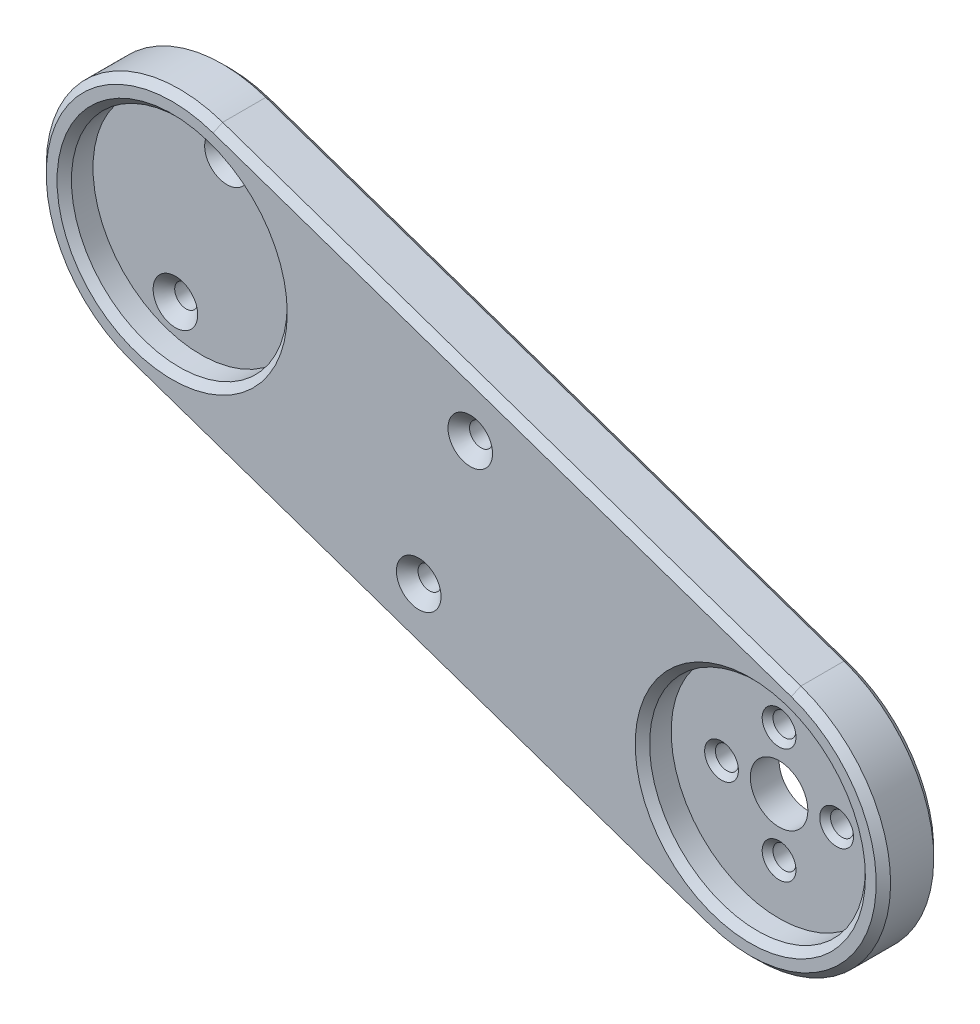
ISO-10303-21;
HEADER;
FILE_DESCRIPTION(('STEP AP214'),'2;1');
FILE_NAME('part.step','',(''),(''),'','','');
FILE_SCHEMA(('AUTOMOTIVE_DESIGN { 1 0 10303 214 1 1 1 1 }'));
ENDSEC;
DATA;
#1=APPLICATION_CONTEXT('core data for automotive mechanical design processes');
#2=APPLICATION_PROTOCOL_DEFINITION('international standard','automotive_design',2000,#1);
#3=PRODUCT_CONTEXT('',#1,'mechanical');
#4=PRODUCT('Part','Part','',(#3));
#5=PRODUCT_RELATED_PRODUCT_CATEGORY('part','',(#4));
#6=PRODUCT_DEFINITION_FORMATION('','',#4);
#7=PRODUCT_DEFINITION_CONTEXT('part definition',#1,'design');
#8=PRODUCT_DEFINITION('design','',#6,#7);
#9=PRODUCT_DEFINITION_SHAPE('','',#8);
#10=(LENGTH_UNIT() NAMED_UNIT(*) SI_UNIT(.MILLI.,.METRE.));
#11=(NAMED_UNIT(*) PLANE_ANGLE_UNIT() SI_UNIT($,.RADIAN.));
#12=(NAMED_UNIT(*) SI_UNIT($,.STERADIAN.) SOLID_ANGLE_UNIT());
#13=UNCERTAINTY_MEASURE_WITH_UNIT(LENGTH_MEASURE(1.E-05),#10,'distance_accuracy_value','');
#14=(GEOMETRIC_REPRESENTATION_CONTEXT(3) GLOBAL_UNCERTAINTY_ASSIGNED_CONTEXT((#13)) GLOBAL_UNIT_ASSIGNED_CONTEXT((#10,
#11,#12)) REPRESENTATION_CONTEXT('',''));
#15=CARTESIAN_POINT('',(0.,0.,0.));
#16=DIRECTION('',(0.,0.,1.));
#17=DIRECTION('',(1.,0.,0.));
#18=AXIS2_PLACEMENT_3D('',#15,#16,#17);
#19=CARTESIAN_POINT('',(0.,0.,8.));
#20=DIRECTION('',(0.,0.,1.));
#21=DIRECTION('',(1.,0.,0.));
#22=AXIS2_PLACEMENT_3D('',#19,#20,#21);
#23=PLANE('',#22);
#24=CARTESIAN_POINT('',(2.24223849890242,2.14230143074263,8.));
#25=DIRECTION('',(0.,0.,1.));
#26=DIRECTION('',(1.,0.,0.));
#27=AXIS2_PLACEMENT_3D('',#24,#25,#26);
#28=CIRCLE('',#27,17.5);
#29=CARTESIAN_POINT('',(-3.45648777626062,-14.4038316172165,8.));
#30=VERTEX_POINT('',#29);
#31=CARTESIAN_POINT('',(7.94096477406545,18.6884344787018,8.));
#32=VERTEX_POINT('',#31);
#33=EDGE_CURVE('E146',#30,#32,#28,.T.);
#34=ORIENTED_EDGE('',*,*,#33,.T.);
#35=DIRECTION('',(-0.945493317026238,0.325641501437888,0.));
#36=VECTOR('',#35,1.);
#37=CARTESIAN_POINT('',(6.5960957782199,19.151626709845,8.));
#38=LINE('',#37,#36);
#39=CARTESIAN_POINT('',(-72.4259671731648,46.3679621009223,8.));
#40=VERTEX_POINT('',#39);
#41=EDGE_CURVE('E150',#32,#40,#38,.T.);
#42=ORIENTED_EDGE('',*,*,#41,.T.);
#43=CARTESIAN_POINT('',(-78.1246934483278,29.8218290529631,8.));
#44=DIRECTION('',(0.,0.,1.));
#45=DIRECTION('',(1.,0.,0.));
#46=AXIS2_PLACEMENT_3D('',#43,#44,#45);
#47=CIRCLE('',#46,17.5);
#48=CARTESIAN_POINT('',(-83.8234197234909,13.2756960050039,8.));
#49=VERTEX_POINT('',#48);
#50=EDGE_CURVE('E148',#40,#49,#47,.T.);
#51=ORIENTED_EDGE('',*,*,#50,.T.);
#52=DIRECTION('',(0.945493317026238,-0.325641501437888,0.));
#53=VECTOR('',#52,1.);
#54=CARTESIAN_POINT('',(-3.45648777626062,-14.4038316172165,8.));
#55=LINE('',#54,#53);
#56=EDGE_CURVE('E143',#49,#30,#55,.T.);
#57=ORIENTED_EDGE('',*,*,#56,.T.);
#58=EDGE_LOOP('',(#34,#42,#51,#57));
#59=FACE_BOUND('',#58,.T.);
#60=CARTESIAN_POINT('',(-36.6830568776465,27.1828714738999,8.));
#61=DIRECTION('',(0.,0.,1.));
#62=DIRECTION('',(1.,0.,0.));
#63=AXIS2_PLACEMENT_3D('',#60,#61,#62);
#64=CIRCLE('',#63,3.10000000000003);
#65=CARTESIAN_POINT('',(-33.5830568776465,27.1828714738999,8.));
#66=VERTEX_POINT('',#65);
#67=EDGE_CURVE('E188',#66,#66,#64,.F.);
#68=ORIENTED_EDGE('',*,*,#67,.T.);
#69=EDGE_LOOP('',(#68));
#70=FACE_BOUND('',#69,.T.);
#71=CARTESIAN_POINT('',(-43.84716990928,6.38201849932264,8.));
#72=DIRECTION('',(0.,0.,1.));
#73=DIRECTION('',(1.,0.,0.));
#74=AXIS2_PLACEMENT_3D('',#71,#72,#73);
#75=CIRCLE('',#74,3.10000000000001);
#76=CARTESIAN_POINT('',(-40.74716990928,6.38201849932264,8.));
#77=VERTEX_POINT('',#76);
#78=EDGE_CURVE('E191',#77,#77,#75,.F.);
#79=ORIENTED_EDGE('',*,*,#78,.T.);
#80=EDGE_LOOP('',(#79));
#81=FACE_BOUND('',#80,.T.);
#82=CARTESIAN_POINT('',(-78.1246934483278,29.8218290529631,8.));
#83=DIRECTION('',(0.,0.,1.));
#84=DIRECTION('',(1.,0.,0.));
#85=AXIS2_PLACEMENT_3D('',#82,#83,#84);
#86=CIRCLE('',#85,16.);
#87=CARTESIAN_POINT('',(-62.1246934483278,29.8218290529631,8.));
#88=VERTEX_POINT('',#87);
#89=EDGE_CURVE('E223',#88,#88,#86,.F.);
#90=ORIENTED_EDGE('',*,*,#89,.T.);
#91=EDGE_LOOP('',(#90));
#92=FACE_BOUND('',#91,.T.);
#93=CARTESIAN_POINT('',(2.24223849890242,2.14230143074263,8.));
#94=DIRECTION('',(0.,0.,1.));
#95=DIRECTION('',(1.,0.,0.));
#96=AXIS2_PLACEMENT_3D('',#93,#94,#95);
#97=CIRCLE('',#96,16.);
#98=CARTESIAN_POINT('',(18.2422384989025,2.14230143074263,8.));
#99=VERTEX_POINT('',#98);
#100=EDGE_CURVE('E220',#99,#99,#97,.F.);
#101=ORIENTED_EDGE('',*,*,#100,.T.);
#102=EDGE_LOOP('',(#101));
#103=FACE_BOUND('',#102,.T.);
#104=ADVANCED_FACE('F38',(#59,#70,#81,#92,#103),#23,.T.);
#105=CARTESIAN_POINT('',(0.,0.,0.));
#106=DIRECTION('',(0.,0.,1.));
#107=DIRECTION('',(1.,0.,0.));
#108=AXIS2_PLACEMENT_3D('',#105,#106,#107);
#109=PLANE('',#108);
#110=CARTESIAN_POINT('',(-78.1246934483278,29.8218290529631,0.));
#111=DIRECTION('',(0.,0.,1.));
#112=DIRECTION('',(1.,0.,0.));
#113=AXIS2_PLACEMENT_3D('',#110,#111,#112);
#114=CIRCLE('',#113,17.5);
#115=CARTESIAN_POINT('',(-83.8234197234909,13.2756960050039,0.));
#116=VERTEX_POINT('',#115);
#117=CARTESIAN_POINT('',(-72.4259671731648,46.3679621009223,0.));
#118=VERTEX_POINT('',#117);
#119=EDGE_CURVE('E115',#116,#118,#114,.F.);
#120=ORIENTED_EDGE('',*,*,#119,.T.);
#121=DIRECTION('',(0.945493317026238,-0.325641501437888,0.));
#122=VECTOR('',#121,1.);
#123=CARTESIAN_POINT('',(7.94096477406545,18.6884344787018,0.));
#124=LINE('',#123,#122);
#125=CARTESIAN_POINT('',(7.94096477406545,18.6884344787018,0.));
#126=VERTEX_POINT('',#125);
#127=EDGE_CURVE('E111',#118,#126,#124,.T.);
#128=ORIENTED_EDGE('',*,*,#127,.T.);
#129=CARTESIAN_POINT('',(2.24223849890242,2.14230143074263,0.));
#130=DIRECTION('',(0.,0.,1.));
#131=DIRECTION('',(1.,0.,0.));
#132=AXIS2_PLACEMENT_3D('',#129,#130,#131);
#133=CIRCLE('',#132,17.5);
#134=CARTESIAN_POINT('',(-3.45648777626062,-14.4038316172165,0.));
#135=VERTEX_POINT('',#134);
#136=EDGE_CURVE('E104',#126,#135,#133,.F.);
#137=ORIENTED_EDGE('',*,*,#136,.T.);
#138=DIRECTION('',(-0.945493317026238,0.325641501437888,0.));
#139=VECTOR('',#138,1.);
#140=CARTESIAN_POINT('',(-4.80135677210617,-13.9406393860733,0.));
#141=LINE('',#140,#139);
#142=EDGE_CURVE('E108',#135,#116,#141,.T.);
#143=ORIENTED_EDGE('',*,*,#142,.T.);
#144=EDGE_LOOP('',(#120,#128,#137,#143));
#145=FACE_BOUND('',#144,.T.);
#146=CARTESIAN_POINT('',(-74.502789558696,40.2085315314155,0.));
#147=DIRECTION('',(0.,0.,1.));
#148=DIRECTION('',(1.,0.,0.));
#149=AXIS2_PLACEMENT_3D('',#146,#147,#148);
#150=CIRCLE('',#149,1.6);
#151=CARTESIAN_POINT('',(-72.902789558696,40.2085315314155,0.));
#152=VERTEX_POINT('',#151);
#153=EDGE_CURVE('E214',#152,#152,#150,.T.);
#154=ORIENTED_EDGE('',*,*,#153,.T.);
#155=EDGE_LOOP('',(#154));
#156=FACE_BOUND('',#155,.T.);
#157=CARTESIAN_POINT('',(-43.84716990928,6.38201849932264,0.));
#158=DIRECTION('',(0.,0.,1.));
#159=DIRECTION('',(1.,0.,0.));
#160=AXIS2_PLACEMENT_3D('',#157,#158,#159);
#161=CIRCLE('',#160,1.6);
#162=CARTESIAN_POINT('',(-42.24716990928,6.38201849932264,0.));
#163=VERTEX_POINT('',#162);
#164=EDGE_CURVE('E211',#163,#163,#161,.T.);
#165=ORIENTED_EDGE('',*,*,#164,.T.);
#166=EDGE_LOOP('',(#165));
#167=FACE_BOUND('',#166,.T.);
#168=CARTESIAN_POINT('',(2.24223849890242,2.14230143074263,0.));
#169=DIRECTION('',(0.,0.,1.));
#170=DIRECTION('',(1.,0.,0.));
#171=AXIS2_PLACEMENT_3D('',#168,#169,#170);
#172=CIRCLE('',#171,4.00000000000001);
#173=CARTESIAN_POINT('',(6.24223849890242,2.14230143074263,0.));
#174=VERTEX_POINT('',#173);
#175=EDGE_CURVE('E217',#174,#174,#172,.T.);
#176=ORIENTED_EDGE('',*,*,#175,.T.);
#177=EDGE_LOOP('',(#176));
#178=FACE_BOUND('',#177,.T.);
#179=CARTESIAN_POINT('',(2.24223849890242,10.1423014307426,0.));
#180=DIRECTION('',(0.,0.,1.));
#181=DIRECTION('',(1.,0.,0.));
#182=AXIS2_PLACEMENT_3D('',#179,#180,#181);
#183=CIRCLE('',#182,1.6);
#184=CARTESIAN_POINT('',(3.84223849890242,10.1423014307426,0.));
#185=VERTEX_POINT('',#184);
#186=EDGE_CURVE('E276',#185,#185,#183,.T.);
#187=ORIENTED_EDGE('',*,*,#186,.T.);
#188=EDGE_LOOP('',(#187));
#189=FACE_BOUND('',#188,.T.);
#190=CARTESIAN_POINT('',(-5.75776150109758,2.14230143074263,0.));
#191=DIRECTION('',(0.,0.,1.));
#192=DIRECTION('',(1.,0.,0.));
#193=AXIS2_PLACEMENT_3D('',#190,#191,#192);
#194=CIRCLE('',#193,1.6);
#195=CARTESIAN_POINT('',(-4.15776150109758,2.14230143074263,0.));
#196=VERTEX_POINT('',#195);
#197=EDGE_CURVE('E273',#196,#196,#194,.T.);
#198=ORIENTED_EDGE('',*,*,#197,.T.);
#199=EDGE_LOOP('',(#198));
#200=FACE_BOUND('',#199,.T.);
#201=CARTESIAN_POINT('',(10.2422384989024,2.14230143074263,0.));
#202=DIRECTION('',(0.,0.,1.));
#203=DIRECTION('',(1.,0.,0.));
#204=AXIS2_PLACEMENT_3D('',#201,#202,#203);
#205=CIRCLE('',#204,1.60000000000001);
#206=CARTESIAN_POINT('',(11.8422384989024,2.14230143074263,0.));
#207=VERTEX_POINT('',#206);
#208=EDGE_CURVE('E270',#207,#207,#205,.T.);
#209=ORIENTED_EDGE('',*,*,#208,.T.);
#210=EDGE_LOOP('',(#209));
#211=FACE_BOUND('',#210,.T.);
#212=CARTESIAN_POINT('',(2.24223849890242,-5.85769856925737,0.));
#213=DIRECTION('',(0.,0.,1.));
#214=DIRECTION('',(1.,0.,0.));
#215=AXIS2_PLACEMENT_3D('',#212,#213,#214);
#216=CIRCLE('',#215,1.60000000000001);
#217=CARTESIAN_POINT('',(3.84223849890242,-5.85769856925737,0.));
#218=VERTEX_POINT('',#217);
#219=EDGE_CURVE('E267',#218,#218,#216,.T.);
#220=ORIENTED_EDGE('',*,*,#219,.T.);
#221=EDGE_LOOP('',(#220));
#222=FACE_BOUND('',#221,.T.);
#223=CARTESIAN_POINT('',(-81.6669025903295,19.4076785568382,0.));
#224=DIRECTION('',(0.,0.,1.));
#225=DIRECTION('',(1.,0.,0.));
#226=AXIS2_PLACEMENT_3D('',#223,#224,#225);
#227=CIRCLE('',#226,1.6);
#228=CARTESIAN_POINT('',(-80.0669025903295,19.4076785568382,0.));
#229=VERTEX_POINT('',#228);
#230=EDGE_CURVE('E133',#229,#229,#227,.F.);
#231=ORIENTED_EDGE('',*,*,#230,.F.);
#232=EDGE_LOOP('',(#231));
#233=FACE_BOUND('',#232,.T.);
#234=CARTESIAN_POINT('',(-36.6830568776465,27.1828714738999,0.));
#235=DIRECTION('',(0.,0.,1.));
#236=DIRECTION('',(1.,0.,0.));
#237=AXIS2_PLACEMENT_3D('',#234,#235,#236);
#238=CIRCLE('',#237,1.6);
#239=CARTESIAN_POINT('',(-35.0830568776465,27.1828714738999,0.));
#240=VERTEX_POINT('',#239);
#241=EDGE_CURVE('E207',#240,#240,#238,.F.);
#242=ORIENTED_EDGE('',*,*,#241,.F.);
#243=EDGE_LOOP('',(#242));
#244=FACE_BOUND('',#243,.T.);
#245=ADVANCED_FACE('F106',(#145,#156,#167,#178,#189,#200,#211,#222,#233,#244),#109,.F.);
#246=CARTESIAN_POINT('',(0.,0.,4.));
#247=DIRECTION('',(0.,0.,1.));
#248=DIRECTION('',(1.,0.,0.));
#249=AXIS2_PLACEMENT_3D('',#246,#247,#248);
#250=PLANE('',#249);
#251=CARTESIAN_POINT('',(-74.502789558696,40.2085315314155,4.));
#252=DIRECTION('',(0.,0.,1.));
#253=DIRECTION('',(1.,0.,0.));
#254=AXIS2_PLACEMENT_3D('',#251,#252,#253);
#255=CIRCLE('',#254,3.10000000000003);
#256=CARTESIAN_POINT('',(-71.4027895586959,40.2085315314155,4.));
#257=VERTEX_POINT('',#256);
#258=EDGE_CURVE('E197',#257,#257,#255,.F.);
#259=ORIENTED_EDGE('',*,*,#258,.T.);
#260=EDGE_LOOP('',(#259));
#261=FACE_BOUND('',#260,.T.);
#262=CARTESIAN_POINT('',(-81.6669025903295,19.4076785568382,4.));
#263=DIRECTION('',(0.,0.,1.));
#264=DIRECTION('',(1.,0.,0.));
#265=AXIS2_PLACEMENT_3D('',#262,#263,#264);
#266=CIRCLE('',#265,3.10000000000003);
#267=CARTESIAN_POINT('',(-78.5669025903295,19.4076785568382,4.));
#268=VERTEX_POINT('',#267);
#269=EDGE_CURVE('E200',#268,#268,#266,.F.);
#270=ORIENTED_EDGE('',*,*,#269,.T.);
#271=EDGE_LOOP('',(#270));
#272=FACE_BOUND('',#271,.T.);
#273=CARTESIAN_POINT('',(-78.1246934483278,29.8218290529631,4.));
#274=DIRECTION('',(0.,0.,1.));
#275=DIRECTION('',(1.,0.,0.));
#276=AXIS2_PLACEMENT_3D('',#273,#274,#275);
#277=CIRCLE('',#276,15.);
#278=CARTESIAN_POINT('',(-63.1246934483278,29.8218290529631,4.));
#279=VERTEX_POINT('',#278);
#280=EDGE_CURVE('E253',#279,#279,#277,.T.);
#281=ORIENTED_EDGE('',*,*,#280,.T.);
#282=EDGE_LOOP('',(#281));
#283=FACE_BOUND('',#282,.T.);
#284=ADVANCED_FACE('F290',(#261,#272,#283),#250,.T.);
#285=CARTESIAN_POINT('',(-5.12699827354406,-14.8861327030995,8.));
#286=DIRECTION('',(0.325641501437888,0.945493317026238,0.));
#287=DIRECTION('',(-0.945493317026238,0.325641501437888,0.));
#288=AXIS2_PLACEMENT_3D('',#285,#286,#287);
#289=PLANE('',#288);
#290=DIRECTION('',(0.,0.,-1.));
#291=VECTOR('',#290,1.);
#292=CARTESIAN_POINT('',(-3.7821292776985,-15.3493249342428,8.));
#293=LINE('',#292,#291);
#294=CARTESIAN_POINT('',(-3.7821292776985,-15.3493249342428,7.00000000000002));
#295=VERTEX_POINT('',#294);
#296=CARTESIAN_POINT('',(-3.7821292776985,-15.3493249342428,0.999999999999987));
#297=VERTEX_POINT('',#296);
#298=EDGE_CURVE('E259',#295,#297,#293,.T.);
#299=ORIENTED_EDGE('',*,*,#298,.F.);
#300=DIRECTION('',(-0.945493317026238,0.325641501437888,0.));
#301=VECTOR('',#300,1.);
#302=CARTESIAN_POINT('',(-84.1490612249288,12.3302026879777,7.00000000000002));
#303=LINE('',#302,#301);
#304=CARTESIAN_POINT('',(-84.1490612249288,12.3302026879777,7.00000000000002));
#305=VERTEX_POINT('',#304);
#306=EDGE_CURVE('E11',#295,#305,#303,.T.);
#307=ORIENTED_EDGE('',*,*,#306,.T.);
#308=DIRECTION('',(0.,0.,-1.));
#309=VECTOR('',#308,1.);
#310=CARTESIAN_POINT('',(-84.1490612249288,12.3302026879777,8.));
#311=LINE('',#310,#309);
#312=CARTESIAN_POINT('',(-84.1490612249288,12.3302026879777,0.999999999999987));
#313=VERTEX_POINT('',#312);
#314=EDGE_CURVE('E265',#305,#313,#311,.T.);
#315=ORIENTED_EDGE('',*,*,#314,.T.);
#316=DIRECTION('',(0.945493317026238,-0.325641501437888,0.));
#317=VECTOR('',#316,1.);
#318=CARTESIAN_POINT('',(-5.12699827354406,-14.8861327030995,0.999999999999987));
#319=LINE('',#318,#317);
#320=EDGE_CURVE('E144',#313,#297,#319,.T.);
#321=ORIENTED_EDGE('',*,*,#320,.T.);
#322=EDGE_LOOP('',(#299,#307,#315,#321));
#323=FACE_BOUND('',#322,.T.);
#324=ADVANCED_FACE('F335',(#323),#289,.F.);
#325=CARTESIAN_POINT('',(2.24223849890242,2.14230143074263,8.));
#326=DIRECTION('',(0.,0.,-1.));
#327=DIRECTION('',(-1.,0.,0.));
#328=AXIS2_PLACEMENT_3D('',#325,#326,#327);
#329=CYLINDRICAL_SURFACE('',#328,18.5);
#330=DIRECTION('',(0.,0.,-1.));
#331=VECTOR('',#330,1.);
#332=CARTESIAN_POINT('',(8.26660627550334,19.633927795728,8.));
#333=LINE('',#332,#331);
#334=CARTESIAN_POINT('',(8.26660627550334,19.633927795728,7.00000000000001));
#335=VERTEX_POINT('',#334);
#336=CARTESIAN_POINT('',(8.26660627550334,19.633927795728,0.999999999999987));
#337=VERTEX_POINT('',#336);
#338=EDGE_CURVE('E261',#335,#337,#333,.T.);
#339=ORIENTED_EDGE('',*,*,#338,.F.);
#340=CARTESIAN_POINT('',(2.24223849890242,2.14230143074263,7.00000000000001));
#341=DIRECTION('',(0.,0.,1.));
#342=DIRECTION('',(1.,0.,0.));
#343=AXIS2_PLACEMENT_3D('',#340,#341,#342);
#344=CIRCLE('',#343,18.5);
#345=EDGE_CURVE('E48',#335,#295,#344,.F.);
#346=ORIENTED_EDGE('',*,*,#345,.T.);
#347=ORIENTED_EDGE('',*,*,#298,.T.);
#348=CARTESIAN_POINT('',(2.24223849890242,2.14230143074263,0.999999999999987));
#349=DIRECTION('',(0.,0.,1.));
#350=DIRECTION('',(1.,0.,0.));
#351=AXIS2_PLACEMENT_3D('',#348,#349,#350);
#352=CIRCLE('',#351,18.5);
#353=EDGE_CURVE('E130',#297,#337,#352,.T.);
#354=ORIENTED_EDGE('',*,*,#353,.T.);
#355=EDGE_LOOP('',(#339,#346,#347,#354));
#356=FACE_BOUND('',#355,.T.);
#357=ADVANCED_FACE('F331',(#356),#329,.T.);
#358=CARTESIAN_POINT('',(6.92173727965778,20.0971200268713,8.));
#359=DIRECTION('',(0.325641501437888,0.945493317026238,0.));
#360=DIRECTION('',(-0.945493317026238,0.325641501437888,0.));
#361=AXIS2_PLACEMENT_3D('',#358,#359,#360);
#362=PLANE('',#361);
#363=DIRECTION('',(0.,0.,-1.));
#364=VECTOR('',#363,1.);
#365=CARTESIAN_POINT('',(-72.1003256717269,47.3134554179485,8.));
#366=LINE('',#365,#364);
#367=CARTESIAN_POINT('',(-72.1003256717269,47.3134554179485,7.00000000000001));
#368=VERTEX_POINT('',#367);
#369=CARTESIAN_POINT('',(-72.1003256717269,47.3134554179485,0.999999999999987));
#370=VERTEX_POINT('',#369);
#371=EDGE_CURVE('E263',#368,#370,#366,.T.);
#372=ORIENTED_EDGE('',*,*,#371,.F.);
#373=DIRECTION('',(0.945493317026238,-0.325641501437888,0.));
#374=VECTOR('',#373,1.);
#375=CARTESIAN_POINT('',(6.92173727965778,20.0971200268713,7.00000000000001));
#376=LINE('',#375,#374);
#377=EDGE_CURVE('E140',#368,#335,#376,.T.);
#378=ORIENTED_EDGE('',*,*,#377,.T.);
#379=ORIENTED_EDGE('',*,*,#338,.T.);
#380=DIRECTION('',(-0.945493317026238,0.325641501437888,0.));
#381=VECTOR('',#380,1.);
#382=CARTESIAN_POINT('',(-72.1003256717269,47.3134554179485,0.999999999999987));
#383=LINE('',#382,#381);
#384=EDGE_CURVE('E178',#337,#370,#383,.T.);
#385=ORIENTED_EDGE('',*,*,#384,.T.);
#386=EDGE_LOOP('',(#372,#378,#379,#385));
#387=FACE_BOUND('',#386,.T.);
#388=ADVANCED_FACE('F327',(#387),#362,.T.);
#389=CARTESIAN_POINT('',(2.24223849890242,2.14230143074263,8.));
#390=DIRECTION('',(0.,0.,-1.));
#391=DIRECTION('',(-1.,0.,0.));
#392=AXIS2_PLACEMENT_3D('',#389,#390,#391);
#393=CYLINDRICAL_SURFACE('',#392,15.);
#394=CARTESIAN_POINT('',(2.24223849890242,2.14230143074263,6.99999999999997));
#395=DIRECTION('',(0.,0.,1.));
#396=DIRECTION('',(1.,0.,0.));
#397=AXIS2_PLACEMENT_3D('',#394,#395,#396);
#398=CIRCLE('',#397,15.);
#399=CARTESIAN_POINT('',(17.2422384989024,2.14230143074263,6.99999999999997));
#400=VERTEX_POINT('',#399);
#401=EDGE_CURVE('E226',#400,#400,#398,.T.);
#402=ORIENTED_EDGE('',*,*,#401,.T.);
#403=EDGE_LOOP('',(#402));
#404=FACE_BOUND('',#403,.T.);
#405=CARTESIAN_POINT('',(2.24223849890242,2.14230143074263,4.));
#406=DIRECTION('',(0.,0.,1.));
#407=DIRECTION('',(1.,0.,0.));
#408=AXIS2_PLACEMENT_3D('',#405,#406,#407);
#409=CIRCLE('',#408,15.);
#410=CARTESIAN_POINT('',(17.2422384989024,2.14230143074263,4.));
#411=VERTEX_POINT('',#410);
#412=EDGE_CURVE('E256',#411,#411,#409,.T.);
#413=ORIENTED_EDGE('',*,*,#412,.F.);
#414=EDGE_LOOP('',(#413));
#415=FACE_BOUND('',#414,.T.);
#416=ADVANCED_FACE('F330',(#404,#415),#393,.F.);
#417=CARTESIAN_POINT('',(-78.1246934483278,29.8218290529631,8.));
#418=DIRECTION('',(0.,0.,-1.));
#419=DIRECTION('',(-1.,0.,0.));
#420=AXIS2_PLACEMENT_3D('',#417,#418,#419);
#421=CYLINDRICAL_SURFACE('',#420,15.);
#422=CARTESIAN_POINT('',(-78.1246934483278,29.8218290529631,6.99999999999997));
#423=DIRECTION('',(0.,0.,1.));
#424=DIRECTION('',(1.,0.,0.));
#425=AXIS2_PLACEMENT_3D('',#422,#423,#424);
#426=CIRCLE('',#425,15.);
#427=CARTESIAN_POINT('',(-63.1246934483278,29.8218290529631,6.99999999999997));
#428=VERTEX_POINT('',#427);
#429=EDGE_CURVE('E206',#428,#428,#426,.T.);
#430=ORIENTED_EDGE('',*,*,#429,.T.);
#431=EDGE_LOOP('',(#430));
#432=FACE_BOUND('',#431,.T.);
#433=ORIENTED_EDGE('',*,*,#280,.F.);
#434=EDGE_LOOP('',(#433));
#435=FACE_BOUND('',#434,.T.);
#436=ADVANCED_FACE('F325',(#432,#435),#421,.F.);
#437=CARTESIAN_POINT('',(-78.1246934483278,29.8218290529631,8.));
#438=DIRECTION('',(0.,0.,-1.));
#439=DIRECTION('',(-1.,0.,0.));
#440=AXIS2_PLACEMENT_3D('',#437,#438,#439);
#441=CYLINDRICAL_SURFACE('',#440,18.5);
#442=ORIENTED_EDGE('',*,*,#314,.F.);
#443=CARTESIAN_POINT('',(-78.1246934483278,29.8218290529631,7.00000000000001));
#444=DIRECTION('',(0.,0.,1.));
#445=DIRECTION('',(1.,0.,0.));
#446=AXIS2_PLACEMENT_3D('',#443,#444,#445);
#447=CIRCLE('',#446,18.5);
#448=EDGE_CURVE('E153',#305,#368,#447,.F.);
#449=ORIENTED_EDGE('',*,*,#448,.T.);
#450=ORIENTED_EDGE('',*,*,#371,.T.);
#451=CARTESIAN_POINT('',(-78.1246934483278,29.8218290529631,0.999999999999987));
#452=DIRECTION('',(0.,0.,1.));
#453=DIRECTION('',(1.,0.,0.));
#454=AXIS2_PLACEMENT_3D('',#451,#452,#453);
#455=CIRCLE('',#454,18.5);
#456=EDGE_CURVE('E175',#370,#313,#455,.T.);
#457=ORIENTED_EDGE('',*,*,#456,.T.);
#458=EDGE_LOOP('',(#442,#449,#450,#457));
#459=FACE_BOUND('',#458,.T.);
#460=ADVANCED_FACE('F321',(#459),#441,.T.);
#461=CARTESIAN_POINT('',(2.24223849890242,-5.85769856925737,4.));
#462=DIRECTION('',(0.,0.,-1.));
#463=DIRECTION('',(-1.,0.,0.));
#464=AXIS2_PLACEMENT_3D('',#461,#462,#463);
#465=CYLINDRICAL_SURFACE('',#464,1.60000000000001);
#466=CARTESIAN_POINT('',(2.24223849890242,-5.85769856925737,3.25000000000001));
#467=DIRECTION('',(0.,0.,1.));
#468=DIRECTION('',(1.,0.,0.));
#469=AXIS2_PLACEMENT_3D('',#466,#467,#468);
#470=CIRCLE('',#469,1.60000000000001);
#471=CARTESIAN_POINT('',(3.84223849890242,-5.85769856925737,3.25000000000001));
#472=VERTEX_POINT('',#471);
#473=EDGE_CURVE('E235',#472,#472,#470,.T.);
#474=ORIENTED_EDGE('',*,*,#473,.T.);
#475=EDGE_LOOP('',(#474));
#476=FACE_BOUND('',#475,.T.);
#477=ORIENTED_EDGE('',*,*,#219,.F.);
#478=EDGE_LOOP('',(#477));
#479=FACE_BOUND('',#478,.T.);
#480=ADVANCED_FACE('F324',(#476,#479),#465,.F.);
#481=CARTESIAN_POINT('',(10.2422384989024,2.14230143074263,4.));
#482=DIRECTION('',(0.,0.,-1.));
#483=DIRECTION('',(-1.,0.,0.));
#484=AXIS2_PLACEMENT_3D('',#481,#482,#483);
#485=CYLINDRICAL_SURFACE('',#484,1.60000000000001);
#486=CARTESIAN_POINT('',(10.2422384989024,2.14230143074263,3.24999999999998));
#487=DIRECTION('',(0.,0.,1.));
#488=DIRECTION('',(1.,0.,0.));
#489=AXIS2_PLACEMENT_3D('',#486,#487,#488);
#490=CIRCLE('',#489,1.60000000000001);
#491=CARTESIAN_POINT('',(11.8422384989024,2.14230143074263,3.24999999999998));
#492=VERTEX_POINT('',#491);
#493=EDGE_CURVE('E232',#492,#492,#490,.T.);
#494=ORIENTED_EDGE('',*,*,#493,.T.);
#495=EDGE_LOOP('',(#494));
#496=FACE_BOUND('',#495,.T.);
#497=ORIENTED_EDGE('',*,*,#208,.F.);
#498=EDGE_LOOP('',(#497));
#499=FACE_BOUND('',#498,.T.);
#500=ADVANCED_FACE('F624',(#496,#499),#485,.F.);
#501=CARTESIAN_POINT('',(-5.75776150109758,2.14230143074263,4.));
#502=DIRECTION('',(0.,0.,-1.));
#503=DIRECTION('',(-1.,0.,0.));
#504=AXIS2_PLACEMENT_3D('',#501,#502,#503);
#505=CYLINDRICAL_SURFACE('',#504,1.6);
#506=CARTESIAN_POINT('',(-5.75776150109758,2.14230143074263,3.25));
#507=DIRECTION('',(0.,0.,1.));
#508=DIRECTION('',(1.,0.,0.));
#509=AXIS2_PLACEMENT_3D('',#506,#507,#508);
#510=CIRCLE('',#509,1.6);
#511=CARTESIAN_POINT('',(-4.15776150109758,2.14230143074263,3.25));
#512=VERTEX_POINT('',#511);
#513=EDGE_CURVE('E250',#512,#512,#510,.T.);
#514=ORIENTED_EDGE('',*,*,#513,.T.);
#515=EDGE_LOOP('',(#514));
#516=FACE_BOUND('',#515,.T.);
#517=ORIENTED_EDGE('',*,*,#197,.F.);
#518=EDGE_LOOP('',(#517));
#519=FACE_BOUND('',#518,.T.);
#520=ADVANCED_FACE('F615',(#516,#519),#505,.F.);
#521=CARTESIAN_POINT('',(2.24223849890242,10.1423014307426,4.));
#522=DIRECTION('',(0.,0.,-1.));
#523=DIRECTION('',(-1.,0.,0.));
#524=AXIS2_PLACEMENT_3D('',#521,#522,#523);
#525=CYLINDRICAL_SURFACE('',#524,1.6);
#526=CARTESIAN_POINT('',(2.24223849890242,10.1423014307426,3.25));
#527=DIRECTION('',(0.,0.,1.));
#528=DIRECTION('',(1.,0.,0.));
#529=AXIS2_PLACEMENT_3D('',#526,#527,#528);
#530=CIRCLE('',#529,1.6);
#531=CARTESIAN_POINT('',(3.84223849890242,10.1423014307426,3.25));
#532=VERTEX_POINT('',#531);
#533=EDGE_CURVE('E229',#532,#532,#530,.T.);
#534=ORIENTED_EDGE('',*,*,#533,.T.);
#535=EDGE_LOOP('',(#534));
#536=FACE_BOUND('',#535,.T.);
#537=ORIENTED_EDGE('',*,*,#186,.F.);
#538=EDGE_LOOP('',(#537));
#539=FACE_BOUND('',#538,.T.);
#540=ADVANCED_FACE('F318',(#536,#539),#525,.F.);
#541=CARTESIAN_POINT('',(0.,0.,4.));
#542=DIRECTION('',(0.,0.,1.));
#543=DIRECTION('',(1.,0.,0.));
#544=AXIS2_PLACEMENT_3D('',#541,#542,#543);
#545=PLANE('',#544);
#546=CARTESIAN_POINT('',(2.24223849890242,2.14230143074263,4.));
#547=DIRECTION('',(0.,0.,1.));
#548=DIRECTION('',(1.,0.,0.));
#549=AXIS2_PLACEMENT_3D('',#546,#547,#548);
#550=CIRCLE('',#549,4.00000000000001);
#551=CARTESIAN_POINT('',(6.24223849890242,2.14230143074263,4.));
#552=VERTEX_POINT('',#551);
#553=EDGE_CURVE('E210',#552,#552,#550,.T.);
#554=ORIENTED_EDGE('',*,*,#553,.F.);
#555=EDGE_LOOP('',(#554));
#556=FACE_BOUND('',#555,.T.);
#557=CARTESIAN_POINT('',(-5.75776150109758,2.14230143074263,4.));
#558=DIRECTION('',(0.,0.,1.));
#559=DIRECTION('',(1.,0.,0.));
#560=AXIS2_PLACEMENT_3D('',#557,#558,#559);
#561=CIRCLE('',#560,2.34999999999999);
#562=CARTESIAN_POINT('',(-3.40776150109759,2.14230143074263,4.));
#563=VERTEX_POINT('',#562);
#564=EDGE_CURVE('E238',#563,#563,#561,.F.);
#565=ORIENTED_EDGE('',*,*,#564,.T.);
#566=EDGE_LOOP('',(#565));
#567=FACE_BOUND('',#566,.T.);
#568=CARTESIAN_POINT('',(2.24223849890242,-5.85769856925737,4.));
#569=DIRECTION('',(0.,0.,1.));
#570=DIRECTION('',(1.,0.,0.));
#571=AXIS2_PLACEMENT_3D('',#568,#569,#570);
#572=CIRCLE('',#571,2.34999999999999);
#573=CARTESIAN_POINT('',(4.59223849890241,-5.85769856925737,4.));
#574=VERTEX_POINT('',#573);
#575=EDGE_CURVE('E241',#574,#574,#572,.F.);
#576=ORIENTED_EDGE('',*,*,#575,.T.);
#577=EDGE_LOOP('',(#576));
#578=FACE_BOUND('',#577,.T.);
#579=CARTESIAN_POINT('',(10.2422384989024,2.14230143074263,4.));
#580=DIRECTION('',(0.,0.,1.));
#581=DIRECTION('',(1.,0.,0.));
#582=AXIS2_PLACEMENT_3D('',#579,#580,#581);
#583=CIRCLE('',#582,2.35000000000003);
#584=CARTESIAN_POINT('',(12.5922384989025,2.14230143074263,4.));
#585=VERTEX_POINT('',#584);
#586=EDGE_CURVE('E244',#585,#585,#583,.F.);
#587=ORIENTED_EDGE('',*,*,#586,.T.);
#588=EDGE_LOOP('',(#587));
#589=FACE_BOUND('',#588,.T.);
#590=CARTESIAN_POINT('',(2.24223849890242,10.1423014307426,4.));
#591=DIRECTION('',(0.,0.,1.));
#592=DIRECTION('',(1.,0.,0.));
#593=AXIS2_PLACEMENT_3D('',#590,#591,#592);
#594=CIRCLE('',#593,2.34999999999999);
#595=CARTESIAN_POINT('',(4.59223849890241,10.1423014307426,4.));
#596=VERTEX_POINT('',#595);
#597=EDGE_CURVE('E247',#596,#596,#594,.F.);
#598=ORIENTED_EDGE('',*,*,#597,.T.);
#599=EDGE_LOOP('',(#598));
#600=FACE_BOUND('',#599,.T.);
#601=ORIENTED_EDGE('',*,*,#412,.T.);
#602=EDGE_LOOP('',(#601));
#603=FACE_BOUND('',#602,.T.);
#604=ADVANCED_FACE('F352',(#556,#567,#578,#589,#600,#603),#545,.T.);
#605=CARTESIAN_POINT('',(-5.75776150109758,2.14230143074263,3.25));
#606=DIRECTION('',(0.,0.,1.));
#607=DIRECTION('',(1.,0.,0.));
#608=AXIS2_PLACEMENT_3D('',#605,#606,#607);
#609=CONICAL_SURFACE('',#608,1.6,0.785398163397445);
#610=ORIENTED_EDGE('',*,*,#564,.F.);
#611=EDGE_LOOP('',(#610));
#612=FACE_BOUND('',#611,.T.);
#613=ORIENTED_EDGE('',*,*,#513,.F.);
#614=EDGE_LOOP('',(#613));
#615=FACE_BOUND('',#614,.T.);
#616=ADVANCED_FACE('F345',(#612,#615),#609,.F.);
#617=CARTESIAN_POINT('',(2.24223849890242,-5.85769856925737,3.25000000000001));
#618=DIRECTION('',(0.,0.,1.));
#619=DIRECTION('',(1.,0.,0.));
#620=AXIS2_PLACEMENT_3D('',#617,#618,#619);
#621=CONICAL_SURFACE('',#620,1.60000000000001,0.785398163397444);
#622=ORIENTED_EDGE('',*,*,#575,.F.);
#623=EDGE_LOOP('',(#622));
#624=FACE_BOUND('',#623,.T.);
#625=ORIENTED_EDGE('',*,*,#473,.F.);
#626=EDGE_LOOP('',(#625));
#627=FACE_BOUND('',#626,.T.);
#628=ADVANCED_FACE('F351',(#624,#627),#621,.F.);
#629=CARTESIAN_POINT('',(10.2422384989024,2.14230143074263,3.24999999999997));
#630=DIRECTION('',(0.,0.,1.));
#631=DIRECTION('',(1.,0.,0.));
#632=AXIS2_PLACEMENT_3D('',#629,#630,#631);
#633=CONICAL_SURFACE('',#632,1.60000000000001,0.785398163397445);
#634=ORIENTED_EDGE('',*,*,#586,.F.);
#635=EDGE_LOOP('',(#634));
#636=FACE_BOUND('',#635,.T.);
#637=ORIENTED_EDGE('',*,*,#493,.F.);
#638=EDGE_LOOP('',(#637));
#639=FACE_BOUND('',#638,.T.);
#640=ADVANCED_FACE('F359',(#636,#639),#633,.F.);
#641=CARTESIAN_POINT('',(2.24223849890242,10.1423014307426,3.25));
#642=DIRECTION('',(0.,0.,1.));
#643=DIRECTION('',(1.,0.,0.));
#644=AXIS2_PLACEMENT_3D('',#641,#642,#643);
#645=CONICAL_SURFACE('',#644,1.6,0.785398163397445);
#646=ORIENTED_EDGE('',*,*,#597,.F.);
#647=EDGE_LOOP('',(#646));
#648=FACE_BOUND('',#647,.T.);
#649=ORIENTED_EDGE('',*,*,#533,.F.);
#650=EDGE_LOOP('',(#649));
#651=FACE_BOUND('',#650,.T.);
#652=ADVANCED_FACE('F366',(#648,#651),#645,.F.);
#653=CARTESIAN_POINT('',(2.24223849890242,2.14230143074263,6.99999999999997));
#654=DIRECTION('',(0.,0.,1.));
#655=DIRECTION('',(1.,0.,0.));
#656=AXIS2_PLACEMENT_3D('',#653,#654,#655);
#657=CONICAL_SURFACE('',#656,15.,0.785398163397456);
#658=ORIENTED_EDGE('',*,*,#100,.F.);
#659=EDGE_LOOP('',(#658));
#660=FACE_BOUND('',#659,.T.);
#661=ORIENTED_EDGE('',*,*,#401,.F.);
#662=EDGE_LOOP('',(#661));
#663=FACE_BOUND('',#662,.T.);
#664=ADVANCED_FACE('F373',(#660,#663),#657,.F.);
#665=CARTESIAN_POINT('',(-78.1246934483278,29.8218290529631,6.99999999999997));
#666=DIRECTION('',(0.,0.,1.));
#667=DIRECTION('',(1.,0.,0.));
#668=AXIS2_PLACEMENT_3D('',#665,#666,#667);
#669=CONICAL_SURFACE('',#668,15.,0.785398163397456);
#670=ORIENTED_EDGE('',*,*,#89,.F.);
#671=EDGE_LOOP('',(#670));
#672=FACE_BOUND('',#671,.T.);
#673=ORIENTED_EDGE('',*,*,#429,.F.);
#674=EDGE_LOOP('',(#673));
#675=FACE_BOUND('',#674,.T.);
#676=ADVANCED_FACE('F380',(#672,#675),#669,.F.);
#677=CARTESIAN_POINT('',(2.24223849890242,2.14230143074263,8.));
#678=DIRECTION('',(0.,0.,-1.));
#679=DIRECTION('',(-1.,0.,0.));
#680=AXIS2_PLACEMENT_3D('',#677,#678,#679);
#681=CYLINDRICAL_SURFACE('',#680,4.00000000000001);
#682=ORIENTED_EDGE('',*,*,#553,.T.);
#683=EDGE_LOOP('',(#682));
#684=FACE_BOUND('',#683,.T.);
#685=ORIENTED_EDGE('',*,*,#175,.F.);
#686=EDGE_LOOP('',(#685));
#687=FACE_BOUND('',#686,.T.);
#688=ADVANCED_FACE('F386',(#684,#687),#681,.F.);
#689=CARTESIAN_POINT('',(-81.6669025903295,19.4076785568382,8.));
#690=DIRECTION('',(0.,0.,-1.));
#691=DIRECTION('',(-1.,0.,0.));
#692=AXIS2_PLACEMENT_3D('',#689,#690,#691);
#693=CYLINDRICAL_SURFACE('',#692,1.6);
#694=CARTESIAN_POINT('',(-81.6669025903295,19.4076785568382,2.49999999999998));
#695=DIRECTION('',(0.,0.,1.));
#696=DIRECTION('',(1.,0.,0.));
#697=AXIS2_PLACEMENT_3D('',#694,#695,#696);
#698=CIRCLE('',#697,1.6);
#699=CARTESIAN_POINT('',(-80.0669025903295,19.4076785568382,2.49999999999998));
#700=VERTEX_POINT('',#699);
#701=EDGE_CURVE('E126',#700,#700,#698,.T.);
#702=ORIENTED_EDGE('',*,*,#701,.T.);
#703=EDGE_LOOP('',(#702));
#704=FACE_BOUND('',#703,.T.);
#705=ORIENTED_EDGE('',*,*,#230,.T.);
#706=EDGE_LOOP('',(#705));
#707=FACE_BOUND('',#706,.T.);
#708=ADVANCED_FACE('F286',(#704,#707),#693,.F.);
#709=CARTESIAN_POINT('',(-74.502789558696,40.2085315314155,8.));
#710=DIRECTION('',(0.,0.,-1.));
#711=DIRECTION('',(-1.,0.,0.));
#712=AXIS2_PLACEMENT_3D('',#709,#710,#711);
#713=CYLINDRICAL_SURFACE('',#712,1.6);
#714=CARTESIAN_POINT('',(-74.502789558696,40.2085315314155,2.49999999999999));
#715=DIRECTION('',(0.,0.,1.));
#716=DIRECTION('',(1.,0.,0.));
#717=AXIS2_PLACEMENT_3D('',#714,#715,#716);
#718=CIRCLE('',#717,1.6);
#719=CARTESIAN_POINT('',(-72.902789558696,40.2085315314155,2.49999999999999));
#720=VERTEX_POINT('',#719);
#721=EDGE_CURVE('E203',#720,#720,#718,.T.);
#722=ORIENTED_EDGE('',*,*,#721,.T.);
#723=EDGE_LOOP('',(#722));
#724=FACE_BOUND('',#723,.T.);
#725=ORIENTED_EDGE('',*,*,#153,.F.);
#726=EDGE_LOOP('',(#725));
#727=FACE_BOUND('',#726,.T.);
#728=ADVANCED_FACE('F307',(#724,#727),#713,.F.);
#729=CARTESIAN_POINT('',(-43.84716990928,6.38201849932264,8.));
#730=DIRECTION('',(0.,0.,-1.));
#731=DIRECTION('',(-1.,0.,0.));
#732=AXIS2_PLACEMENT_3D('',#729,#730,#731);
#733=CYLINDRICAL_SURFACE('',#732,1.6);
#734=CARTESIAN_POINT('',(-43.84716990928,6.38201849932264,6.49999999999997));
#735=DIRECTION('',(0.,0.,1.));
#736=DIRECTION('',(1.,0.,0.));
#737=AXIS2_PLACEMENT_3D('',#734,#735,#736);
#738=CIRCLE('',#737,1.6);
#739=CARTESIAN_POINT('',(-42.24716990928,6.38201849932264,6.49999999999997));
#740=VERTEX_POINT('',#739);
#741=EDGE_CURVE('E185',#740,#740,#738,.T.);
#742=ORIENTED_EDGE('',*,*,#741,.T.);
#743=EDGE_LOOP('',(#742));
#744=FACE_BOUND('',#743,.T.);
#745=ORIENTED_EDGE('',*,*,#164,.F.);
#746=EDGE_LOOP('',(#745));
#747=FACE_BOUND('',#746,.T.);
#748=ADVANCED_FACE('F297',(#744,#747),#733,.F.);
#749=CARTESIAN_POINT('',(-36.6830568776465,27.1828714738999,8.));
#750=DIRECTION('',(0.,0.,-1.));
#751=DIRECTION('',(-1.,0.,0.));
#752=AXIS2_PLACEMENT_3D('',#749,#750,#751);
#753=CYLINDRICAL_SURFACE('',#752,1.6);
#754=CARTESIAN_POINT('',(-36.6830568776465,27.1828714738999,6.49999999999999));
#755=DIRECTION('',(0.,0.,1.));
#756=DIRECTION('',(1.,0.,0.));
#757=AXIS2_PLACEMENT_3D('',#754,#755,#756);
#758=CIRCLE('',#757,1.6);
#759=CARTESIAN_POINT('',(-35.0830568776465,27.1828714738999,6.49999999999999));
#760=VERTEX_POINT('',#759);
#761=EDGE_CURVE('E194',#760,#760,#758,.T.);
#762=ORIENTED_EDGE('',*,*,#761,.T.);
#763=EDGE_LOOP('',(#762));
#764=FACE_BOUND('',#763,.T.);
#765=ORIENTED_EDGE('',*,*,#241,.T.);
#766=EDGE_LOOP('',(#765));
#767=FACE_BOUND('',#766,.T.);
#768=ADVANCED_FACE('F294',(#764,#767),#753,.F.);
#769=CARTESIAN_POINT('',(-74.502789558696,40.2085315314155,2.49999999999999));
#770=DIRECTION('',(0.,0.,1.));
#771=DIRECTION('',(1.,0.,0.));
#772=AXIS2_PLACEMENT_3D('',#769,#770,#771);
#773=CONICAL_SURFACE('',#772,1.6,0.785398163397456);
#774=ORIENTED_EDGE('',*,*,#258,.F.);
#775=EDGE_LOOP('',(#774));
#776=FACE_BOUND('',#775,.T.);
#777=ORIENTED_EDGE('',*,*,#721,.F.);
#778=EDGE_LOOP('',(#777));
#779=FACE_BOUND('',#778,.T.);
#780=ADVANCED_FACE('F296',(#776,#779),#773,.F.);
#781=CARTESIAN_POINT('',(-36.6830568776465,27.1828714738999,6.49999999999999));
#782=DIRECTION('',(0.,0.,1.));
#783=DIRECTION('',(1.,0.,0.));
#784=AXIS2_PLACEMENT_3D('',#781,#782,#783);
#785=CONICAL_SURFACE('',#784,1.6,0.785398163397454);
#786=ORIENTED_EDGE('',*,*,#67,.F.);
#787=EDGE_LOOP('',(#786));
#788=FACE_BOUND('',#787,.T.);
#789=ORIENTED_EDGE('',*,*,#761,.F.);
#790=EDGE_LOOP('',(#789));
#791=FACE_BOUND('',#790,.T.);
#792=ADVANCED_FACE('F304',(#788,#791),#785,.F.);
#793=CARTESIAN_POINT('',(-43.84716990928,6.38201849932264,8.));
#794=DIRECTION('',(0.,0.,1.));
#795=DIRECTION('',(1.,0.,0.));
#796=AXIS2_PLACEMENT_3D('',#793,#794,#795);
#797=CONICAL_SURFACE('',#796,3.10000000000001,0.785398163397442);
#798=ORIENTED_EDGE('',*,*,#741,.F.);
#799=EDGE_LOOP('',(#798));
#800=FACE_BOUND('',#799,.T.);
#801=ORIENTED_EDGE('',*,*,#78,.F.);
#802=EDGE_LOOP('',(#801));
#803=FACE_BOUND('',#802,.T.);
#804=ADVANCED_FACE('F397',(#800,#803),#797,.F.);
#805=CARTESIAN_POINT('',(-81.6669025903295,19.4076785568382,4.));
#806=DIRECTION('',(0.,0.,1.));
#807=DIRECTION('',(1.,0.,0.));
#808=AXIS2_PLACEMENT_3D('',#805,#806,#807);
#809=CONICAL_SURFACE('',#808,3.10000000000003,0.785398163397451);
#810=ORIENTED_EDGE('',*,*,#701,.F.);
#811=EDGE_LOOP('',(#810));
#812=FACE_BOUND('',#811,.T.);
#813=ORIENTED_EDGE('',*,*,#269,.F.);
#814=EDGE_LOOP('',(#813));
#815=FACE_BOUND('',#814,.T.);
#816=ADVANCED_FACE('F404',(#812,#815),#809,.F.);
#817=CARTESIAN_POINT('',(-5.12699827354406,-14.8861327030995,0.999999999999987));
#818=DIRECTION('',(0.230263313902499,0.668564736035815,0.707106781186548));
#819=DIRECTION('',(0.945493317026238,-0.325641501437888,0.));
#820=AXIS2_PLACEMENT_3D('',#817,#818,#819);
#821=PLANE('',#820);
#822=DIRECTION('',(0.2302633139025,0.668564736035817,-0.707106781186546));
#823=VECTOR('',#822,1.);
#824=CARTESIAN_POINT('',(-3.7821292776985,-15.3493249342428,0.999999999999987));
#825=LINE('',#824,#823);
#826=EDGE_CURVE('E121',#297,#135,#825,.T.);
#827=ORIENTED_EDGE('',*,*,#826,.F.);
#828=ORIENTED_EDGE('',*,*,#320,.F.);
#829=DIRECTION('',(-0.230263313902505,-0.668564736035815,0.707106781186546));
#830=VECTOR('',#829,1.);
#831=CARTESIAN_POINT('',(-83.8234197234909,13.2756960050039,0.));
#832=LINE('',#831,#830);
#833=EDGE_CURVE('E124',#116,#313,#832,.T.);
#834=ORIENTED_EDGE('',*,*,#833,.F.);
#835=ORIENTED_EDGE('',*,*,#142,.F.);
#836=EDGE_LOOP('',(#827,#828,#834,#835));
#837=FACE_BOUND('',#836,.T.);
#838=ADVANCED_FACE('F119',(#837),#821,.F.);
#839=CARTESIAN_POINT('',(-78.1246934483278,29.8218290529631,0.999999999999987));
#840=DIRECTION('',(0.,0.,1.));
#841=DIRECTION('',(1.,0.,0.));
#842=AXIS2_PLACEMENT_3D('',#839,#840,#841);
#843=CONICAL_SURFACE('',#842,18.5,0.78539816339745);
#844=ORIENTED_EDGE('',*,*,#833,.T.);
#845=ORIENTED_EDGE('',*,*,#456,.F.);
#846=DIRECTION('',(0.230263313902496,0.668564736035817,0.707106781186546));
#847=VECTOR('',#846,1.);
#848=CARTESIAN_POINT('',(-72.4259671731648,46.3679621009223,0.));
#849=LINE('',#848,#847);
#850=EDGE_CURVE('E131',#118,#370,#849,.T.);
#851=ORIENTED_EDGE('',*,*,#850,.F.);
#852=ORIENTED_EDGE('',*,*,#119,.F.);
#853=EDGE_LOOP('',(#844,#845,#851,#852));
#854=FACE_BOUND('',#853,.T.);
#855=ADVANCED_FACE('F424',(#854),#843,.T.);
#856=CARTESIAN_POINT('',(2.24223849890242,2.14230143074263,0.999999999999987));
#857=DIRECTION('',(0.,0.,1.));
#858=DIRECTION('',(1.,0.,0.));
#859=AXIS2_PLACEMENT_3D('',#856,#857,#858);
#860=CONICAL_SURFACE('',#859,18.5,0.78539816339745);
#861=ORIENTED_EDGE('',*,*,#826,.T.);
#862=ORIENTED_EDGE('',*,*,#136,.F.);
#863=DIRECTION('',(-0.2302633139025,-0.668564736035816,-0.707106781186547));
#864=VECTOR('',#863,1.);
#865=CARTESIAN_POINT('',(8.26660627550334,19.633927795728,0.999999999999987));
#866=LINE('',#865,#864);
#867=EDGE_CURVE('E136',#337,#126,#866,.T.);
#868=ORIENTED_EDGE('',*,*,#867,.F.);
#869=ORIENTED_EDGE('',*,*,#353,.F.);
#870=EDGE_LOOP('',(#861,#862,#868,#869));
#871=FACE_BOUND('',#870,.T.);
#872=ADVANCED_FACE('F128',(#871),#860,.T.);
#873=CARTESIAN_POINT('',(6.59609577821989,19.151626709845,0.));
#874=DIRECTION('',(0.230263313902499,0.668564736035814,-0.707106781186548));
#875=DIRECTION('',(-0.945493317026238,0.325641501437888,0.));
#876=AXIS2_PLACEMENT_3D('',#873,#874,#875);
#877=PLANE('',#876);
#878=ORIENTED_EDGE('',*,*,#850,.T.);
#879=ORIENTED_EDGE('',*,*,#384,.F.);
#880=ORIENTED_EDGE('',*,*,#867,.T.);
#881=ORIENTED_EDGE('',*,*,#127,.F.);
#882=EDGE_LOOP('',(#878,#879,#880,#881));
#883=FACE_BOUND('',#882,.T.);
#884=ADVANCED_FACE('F413',(#883),#877,.T.);
#885=CARTESIAN_POINT('',(-4.80135677210617,-13.9406393860733,8.));
#886=DIRECTION('',(-0.230263313902498,-0.668564736035813,0.70710678118655));
#887=DIRECTION('',(-0.945493317026238,0.325641501437888,0.));
#888=AXIS2_PLACEMENT_3D('',#885,#886,#887);
#889=PLANE('',#888);
#890=DIRECTION('',(-0.230263313902501,-0.66856473603582,-0.707106781186543));
#891=VECTOR('',#890,1.);
#892=CARTESIAN_POINT('',(-3.45648777626062,-14.4038316172165,8.));
#893=LINE('',#892,#891);
#894=EDGE_CURVE('E159',#30,#295,#893,.T.);
#895=ORIENTED_EDGE('',*,*,#894,.F.);
#896=ORIENTED_EDGE('',*,*,#56,.F.);
#897=DIRECTION('',(0.230263313902506,0.668564736035818,0.707106781186543));
#898=VECTOR('',#897,1.);
#899=CARTESIAN_POINT('',(-84.1490612249288,12.3302026879777,7.00000000000002));
#900=LINE('',#899,#898);
#901=EDGE_CURVE('E43',#305,#49,#900,.T.);
#902=ORIENTED_EDGE('',*,*,#901,.F.);
#903=ORIENTED_EDGE('',*,*,#306,.F.);
#904=EDGE_LOOP('',(#895,#896,#902,#903));
#905=FACE_BOUND('',#904,.T.);
#906=ADVANCED_FACE('F41',(#905),#889,.T.);
#907=CARTESIAN_POINT('',(-78.1246934483278,29.8218290529631,8.));
#908=DIRECTION('',(0.,0.,-1.));
#909=DIRECTION('',(-1.,0.,0.));
#910=AXIS2_PLACEMENT_3D('',#907,#908,#909);
#911=CONICAL_SURFACE('',#910,17.5,0.785398163397452);
#912=ORIENTED_EDGE('',*,*,#901,.T.);
#913=ORIENTED_EDGE('',*,*,#50,.F.);
#914=DIRECTION('',(-0.230263313902496,-0.668564736035817,0.707106781186546));
#915=VECTOR('',#914,1.);
#916=CARTESIAN_POINT('',(-72.1003256717269,47.3134554179485,7.00000000000001));
#917=LINE('',#916,#915);
#918=EDGE_CURVE('E158',#368,#40,#917,.T.);
#919=ORIENTED_EDGE('',*,*,#918,.F.);
#920=ORIENTED_EDGE('',*,*,#448,.F.);
#921=EDGE_LOOP('',(#912,#913,#919,#920));
#922=FACE_BOUND('',#921,.T.);
#923=ADVANCED_FACE('F447',(#922),#911,.T.);
#924=CARTESIAN_POINT('',(2.24223849890242,2.14230143074263,8.));
#925=DIRECTION('',(0.,0.,-1.));
#926=DIRECTION('',(-1.,0.,0.));
#927=AXIS2_PLACEMENT_3D('',#924,#925,#926);
#928=CONICAL_SURFACE('',#927,17.5,0.78539816339745);
#929=ORIENTED_EDGE('',*,*,#894,.T.);
#930=ORIENTED_EDGE('',*,*,#345,.F.);
#931=DIRECTION('',(0.230263313902499,0.668564736035817,-0.707106781186546));
#932=VECTOR('',#931,1.);
#933=CARTESIAN_POINT('',(7.94096477406545,18.6884344787018,8.));
#934=LINE('',#933,#932);
#935=EDGE_CURVE('E156',#32,#335,#934,.T.);
#936=ORIENTED_EDGE('',*,*,#935,.F.);
#937=ORIENTED_EDGE('',*,*,#33,.F.);
#938=EDGE_LOOP('',(#929,#930,#936,#937));
#939=FACE_BOUND('',#938,.T.);
#940=ADVANCED_FACE('F441',(#939),#928,.T.);
#941=CARTESIAN_POINT('',(6.92173727965778,20.0971200268713,7.00000000000001));
#942=DIRECTION('',(-0.2302633139025,-0.668564736035816,-0.707106781186547));
#943=DIRECTION('',(0.945493317026238,-0.325641501437888,0.));
#944=AXIS2_PLACEMENT_3D('',#941,#942,#943);
#945=PLANE('',#944);
#946=ORIENTED_EDGE('',*,*,#918,.T.);
#947=ORIENTED_EDGE('',*,*,#41,.F.);
#948=ORIENTED_EDGE('',*,*,#935,.T.);
#949=ORIENTED_EDGE('',*,*,#377,.F.);
#950=EDGE_LOOP('',(#946,#947,#948,#949));
#951=FACE_BOUND('',#950,.T.);
#952=ADVANCED_FACE('F435',(#951),#945,.F.);
#953=CLOSED_SHELL('',(#104,#245,#284,#324,#357,#388,#416,#436,#460,#480,#500,#520,#540,#604,
#616,#628,#640,#652,#664,#676,#688,#708,#728,#748,#768,#780,#792,#804,#816,#838,#855,#872,#884,
#906,#923,#940,#952));
#954=MANIFOLD_SOLID_BREP('B2',#953);
#955=ADVANCED_BREP_SHAPE_REPRESENTATION('',(#18,#954),#14);
#956=SHAPE_DEFINITION_REPRESENTATION(#9,#955);
ENDSEC;
END-ISO-10303-21;
